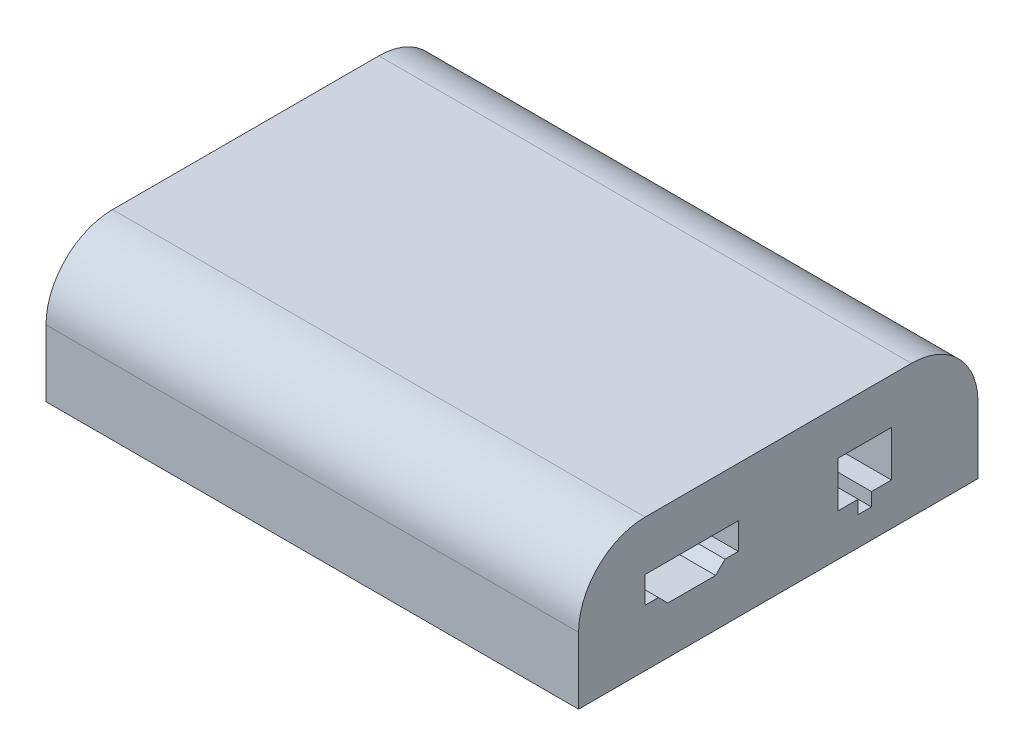
ISO-10303-21;
HEADER;
FILE_DESCRIPTION(('STEP AP214'),'2;1');
FILE_NAME('part.step','',(''),(''),'','','');
FILE_SCHEMA(('AUTOMOTIVE_DESIGN { 1 0 10303 214 1 1 1 1 }'));
ENDSEC;
DATA;
#1=APPLICATION_CONTEXT('core data for automotive mechanical design processes');
#2=APPLICATION_PROTOCOL_DEFINITION('international standard','automotive_design',2000,#1);
#3=PRODUCT_CONTEXT('',#1,'mechanical');
#4=PRODUCT('Part','Part','',(#3));
#5=PRODUCT_RELATED_PRODUCT_CATEGORY('part','',(#4));
#6=PRODUCT_DEFINITION_FORMATION('','',#4);
#7=PRODUCT_DEFINITION_CONTEXT('part definition',#1,'design');
#8=PRODUCT_DEFINITION('design','',#6,#7);
#9=PRODUCT_DEFINITION_SHAPE('','',#8);
#10=(LENGTH_UNIT() NAMED_UNIT(*) SI_UNIT(.MILLI.,.METRE.));
#11=(NAMED_UNIT(*) PLANE_ANGLE_UNIT() SI_UNIT($,.RADIAN.));
#12=(NAMED_UNIT(*) SI_UNIT($,.STERADIAN.) SOLID_ANGLE_UNIT());
#13=UNCERTAINTY_MEASURE_WITH_UNIT(LENGTH_MEASURE(1.E-05),#10,'distance_accuracy_value','');
#14=(GEOMETRIC_REPRESENTATION_CONTEXT(3) GLOBAL_UNCERTAINTY_ASSIGNED_CONTEXT((#13)) GLOBAL_UNIT_ASSIGNED_CONTEXT((#10,
#11,#12)) REPRESENTATION_CONTEXT('',''));
#15=CARTESIAN_POINT('',(0.,0.,0.));
#16=DIRECTION('',(0.,0.,1.));
#17=DIRECTION('',(1.,0.,0.));
#18=AXIS2_PLACEMENT_3D('',#15,#16,#17);
#19=CARTESIAN_POINT('',(0.,20.,0.));
#20=DIRECTION('',(1.,0.,0.));
#21=DIRECTION('',(0.,0.,-1.));
#22=AXIS2_PLACEMENT_3D('',#19,#20,#21);
#23=PLANE('',#22);
#24=DIRECTION('',(0.,0.,-1.));
#25=VECTOR('',#24,1.);
#26=CARTESIAN_POINT('',(0.,12.5290988396238,-10.));
#27=LINE('',#26,#25);
#28=CARTESIAN_POINT('',(0.,12.5290988396238,-10.));
#29=VERTEX_POINT('',#28);
#30=CARTESIAN_POINT('',(0.,12.5290988396238,-24.));
#31=VERTEX_POINT('',#30);
#32=EDGE_CURVE('E290',#29,#31,#27,.T.);
#33=ORIENTED_EDGE('',*,*,#32,.F.);
#34=DIRECTION('',(0.,1.,0.));
#35=VECTOR('',#34,1.);
#36=CARTESIAN_POINT('',(0.,8.52909883962411,-10.0000000000003));
#37=LINE('',#36,#35);
#38=CARTESIAN_POINT('',(0.,8.52909883962411,-10.0000000000003));
#39=VERTEX_POINT('',#38);
#40=EDGE_CURVE('E57',#39,#29,#37,.T.);
#41=ORIENTED_EDGE('',*,*,#40,.F.);
#42=DIRECTION('',(0.,0.,1.));
#43=VECTOR('',#42,1.);
#44=CARTESIAN_POINT('',(0.,8.52909883962411,-12.0000000000003));
#45=LINE('',#44,#43);
#46=CARTESIAN_POINT('',(0.,8.52909883962411,-12.0000000000003));
#47=VERTEX_POINT('',#46);
#48=EDGE_CURVE('E262',#47,#39,#45,.T.);
#49=ORIENTED_EDGE('',*,*,#48,.F.);
#50=DIRECTION('',(0.,0.7071067811867,0.707106781186395));
#51=VECTOR('',#50,1.);
#52=CARTESIAN_POINT('',(0.,7.11488527725071,-13.4142135623731));
#53=LINE('',#52,#51);
#54=CARTESIAN_POINT('',(0.,7.11488527725071,-13.4142135623731));
#55=VERTEX_POINT('',#54);
#56=EDGE_CURVE('E266',#55,#47,#53,.T.);
#57=ORIENTED_EDGE('',*,*,#56,.F.);
#58=DIRECTION('',(0.,0.,1.));
#59=VECTOR('',#58,1.);
#60=CARTESIAN_POINT('',(0.,7.11488527725071,-20.5857864376269));
#61=LINE('',#60,#59);
#62=CARTESIAN_POINT('',(0.,7.11488527725071,-20.5857864376269));
#63=VERTEX_POINT('',#62);
#64=EDGE_CURVE('E305',#63,#55,#61,.T.);
#65=ORIENTED_EDGE('',*,*,#64,.F.);
#66=DIRECTION('',(0.,-0.707106781186553,0.707106781186542));
#67=VECTOR('',#66,1.);
#68=CARTESIAN_POINT('',(0.,8.52909883962382,-22.));
#69=LINE('',#68,#67);
#70=CARTESIAN_POINT('',(0.,8.52909883962382,-22.));
#71=VERTEX_POINT('',#70);
#72=EDGE_CURVE('E301',#71,#63,#69,.T.);
#73=ORIENTED_EDGE('',*,*,#72,.F.);
#74=DIRECTION('',(0.,0.,1.));
#75=VECTOR('',#74,1.);
#76=CARTESIAN_POINT('',(0.,8.52909883962381,-24.));
#77=LINE('',#76,#75);
#78=CARTESIAN_POINT('',(0.,8.52909883962381,-24.));
#79=VERTEX_POINT('',#78);
#80=EDGE_CURVE('E297',#79,#71,#77,.T.);
#81=ORIENTED_EDGE('',*,*,#80,.F.);
#82=DIRECTION('',(0.,-1.,0.));
#83=VECTOR('',#82,1.);
#84=CARTESIAN_POINT('',(0.,12.5290988396238,-24.));
#85=LINE('',#84,#83);
#86=EDGE_CURVE('E293',#31,#79,#85,.T.);
#87=ORIENTED_EDGE('',*,*,#86,.F.);
#88=EDGE_LOOP('',(#33,#41,#49,#57,#65,#73,#81,#87));
#89=FACE_BOUND('',#88,.T.);
#90=DIRECTION('',(0.,-1.,0.));
#91=VECTOR('',#90,1.);
#92=CARTESIAN_POINT('',(0.,20.,0.));
#93=LINE('',#92,#91);
#94=CARTESIAN_POINT('',(0.,10.,0.));
#95=VERTEX_POINT('',#94);
#96=CARTESIAN_POINT('',(0.,0.,0.));
#97=VERTEX_POINT('',#96);
#98=EDGE_CURVE('E541',#95,#97,#93,.T.);
#99=ORIENTED_EDGE('',*,*,#98,.F.);
#100=CARTESIAN_POINT('',(0.,10.,-10.));
#101=DIRECTION('',(1.,0.,0.));
#102=DIRECTION('',(0.,0.,-1.));
#103=AXIS2_PLACEMENT_3D('',#100,#101,#102);
#104=CIRCLE('',#103,10.);
#105=CARTESIAN_POINT('',(0.,20.,-10.));
#106=VERTEX_POINT('',#105);
#107=EDGE_CURVE('E50',#95,#106,#104,.F.);
#108=ORIENTED_EDGE('',*,*,#107,.T.);
#109=DIRECTION('',(0.,0.,1.));
#110=VECTOR('',#109,1.);
#111=CARTESIAN_POINT('',(0.,20.,0.));
#112=LINE('',#111,#110);
#113=CARTESIAN_POINT('',(0.,20.,-50.));
#114=VERTEX_POINT('',#113);
#115=EDGE_CURVE('E509',#114,#106,#112,.T.);
#116=ORIENTED_EDGE('',*,*,#115,.F.);
#117=CARTESIAN_POINT('',(0.,10.,-50.));
#118=DIRECTION('',(1.,0.,0.));
#119=DIRECTION('',(0.,0.,-1.));
#120=AXIS2_PLACEMENT_3D('',#117,#118,#119);
#121=CIRCLE('',#120,10.);
#122=CARTESIAN_POINT('',(0.,10.,-60.));
#123=VERTEX_POINT('',#122);
#124=EDGE_CURVE('E65',#114,#123,#121,.F.);
#125=ORIENTED_EDGE('',*,*,#124,.T.);
#126=DIRECTION('',(0.,-1.,0.));
#127=VECTOR('',#126,1.);
#128=CARTESIAN_POINT('',(0.,20.,-60.));
#129=LINE('',#128,#127);
#130=CARTESIAN_POINT('',(0.,0.,-60.));
#131=VERTEX_POINT('',#130);
#132=EDGE_CURVE('E518',#123,#131,#129,.T.);
#133=ORIENTED_EDGE('',*,*,#132,.T.);
#134=DIRECTION('',(0.,0.,1.));
#135=VECTOR('',#134,1.);
#136=CARTESIAN_POINT('',(0.,0.,0.));
#137=LINE('',#136,#135);
#138=EDGE_CURVE('E401',#131,#97,#137,.T.);
#139=ORIENTED_EDGE('',*,*,#138,.T.);
#140=EDGE_LOOP('',(#99,#108,#116,#125,#133,#139));
#141=FACE_BOUND('',#140,.T.);
#142=ADVANCED_FACE('F41',(#89,#141),#23,.F.);
#143=CARTESIAN_POINT('',(0.,20.,0.));
#144=DIRECTION('',(0.,0.,-1.));
#145=DIRECTION('',(-1.,0.,0.));
#146=AXIS2_PLACEMENT_3D('',#143,#144,#145);
#147=PLANE('',#146);
#148=DIRECTION('',(0.,-1.,0.));
#149=VECTOR('',#148,1.);
#150=CARTESIAN_POINT('',(80.,20.,0.));
#151=LINE('',#150,#149);
#152=CARTESIAN_POINT('',(80.,10.,0.));
#153=VERTEX_POINT('',#152);
#154=CARTESIAN_POINT('',(80.,0.,0.));
#155=VERTEX_POINT('',#154);
#156=EDGE_CURVE('E538',#153,#155,#151,.T.);
#157=ORIENTED_EDGE('',*,*,#156,.F.);
#158=DIRECTION('',(1.,0.,0.));
#159=VECTOR('',#158,1.);
#160=CARTESIAN_POINT('',(0.,10.,0.));
#161=LINE('',#160,#159);
#162=EDGE_CURVE('E558',#153,#95,#161,.F.);
#163=ORIENTED_EDGE('',*,*,#162,.T.);
#164=ORIENTED_EDGE('',*,*,#98,.T.);
#165=DIRECTION('',(1.,0.,0.));
#166=VECTOR('',#165,1.);
#167=CARTESIAN_POINT('',(0.,0.,0.));
#168=LINE('',#167,#166);
#169=EDGE_CURVE('E522',#97,#155,#168,.T.);
#170=ORIENTED_EDGE('',*,*,#169,.T.);
#171=EDGE_LOOP('',(#157,#163,#164,#170));
#172=FACE_BOUND('',#171,.T.);
#173=ADVANCED_FACE('F577',(#172),#147,.F.);
#174=CARTESIAN_POINT('',(80.,20.,0.));
#175=DIRECTION('',(-1.,0.,0.));
#176=DIRECTION('',(0.,0.,1.));
#177=AXIS2_PLACEMENT_3D('',#174,#175,#176);
#178=PLANE('',#177);
#179=DIRECTION('',(0.,-1.,0.));
#180=VECTOR('',#179,1.);
#181=CARTESIAN_POINT('',(80.,12.5290988396238,-10.));
#182=LINE('',#181,#180);
#183=CARTESIAN_POINT('',(80.,12.5290988396238,-10.));
#184=VERTEX_POINT('',#183);
#185=CARTESIAN_POINT('',(80.,8.52909883962411,-10.0000000000003));
#186=VERTEX_POINT('',#185);
#187=EDGE_CURVE('E370',#184,#186,#182,.T.);
#188=ORIENTED_EDGE('',*,*,#187,.F.);
#189=DIRECTION('',(0.,0.,1.));
#190=VECTOR('',#189,1.);
#191=CARTESIAN_POINT('',(80.,12.5290988396238,-24.));
#192=LINE('',#191,#190);
#193=CARTESIAN_POINT('',(80.,12.5290988396238,-24.));
#194=VERTEX_POINT('',#193);
#195=EDGE_CURVE('E367',#194,#184,#192,.T.);
#196=ORIENTED_EDGE('',*,*,#195,.F.);
#197=DIRECTION('',(0.,1.,0.));
#198=VECTOR('',#197,1.);
#199=CARTESIAN_POINT('',(80.,8.52909883962381,-24.));
#200=LINE('',#199,#198);
#201=CARTESIAN_POINT('',(80.,8.52909883962381,-24.));
#202=VERTEX_POINT('',#201);
#203=EDGE_CURVE('E338',#202,#194,#200,.T.);
#204=ORIENTED_EDGE('',*,*,#203,.F.);
#205=DIRECTION('',(0.,0.,-1.));
#206=VECTOR('',#205,1.);
#207=CARTESIAN_POINT('',(80.,8.52909883962382,-22.));
#208=LINE('',#207,#206);
#209=CARTESIAN_POINT('',(80.,8.52909883962382,-22.));
#210=VERTEX_POINT('',#209);
#211=EDGE_CURVE('E391',#210,#202,#208,.T.);
#212=ORIENTED_EDGE('',*,*,#211,.F.);
#213=DIRECTION('',(0.,0.707106781186553,-0.707106781186542));
#214=VECTOR('',#213,1.);
#215=CARTESIAN_POINT('',(80.,7.11488527725071,-20.5857864376269));
#216=LINE('',#215,#214);
#217=CARTESIAN_POINT('',(80.,7.11488527725071,-20.5857864376269));
#218=VERTEX_POINT('',#217);
#219=EDGE_CURVE('E387',#218,#210,#216,.T.);
#220=ORIENTED_EDGE('',*,*,#219,.F.);
#221=DIRECTION('',(0.,0.,-1.));
#222=VECTOR('',#221,1.);
#223=CARTESIAN_POINT('',(80.,7.11488527725071,-13.4142135623731));
#224=LINE('',#223,#222);
#225=CARTESIAN_POINT('',(80.,7.11488527725071,-13.4142135623731));
#226=VERTEX_POINT('',#225);
#227=EDGE_CURVE('E383',#226,#218,#224,.T.);
#228=ORIENTED_EDGE('',*,*,#227,.F.);
#229=DIRECTION('',(0.,-0.7071067811867,-0.707106781186395));
#230=VECTOR('',#229,1.);
#231=CARTESIAN_POINT('',(80.,8.52909883962411,-12.0000000000003));
#232=LINE('',#231,#230);
#233=CARTESIAN_POINT('',(80.,8.52909883962411,-12.0000000000003));
#234=VERTEX_POINT('',#233);
#235=EDGE_CURVE('E379',#234,#226,#232,.T.);
#236=ORIENTED_EDGE('',*,*,#235,.F.);
#237=DIRECTION('',(0.,0.,-1.));
#238=VECTOR('',#237,1.);
#239=CARTESIAN_POINT('',(80.,8.52909883962411,-10.0000000000003));
#240=LINE('',#239,#238);
#241=EDGE_CURVE('E375',#186,#234,#240,.T.);
#242=ORIENTED_EDGE('',*,*,#241,.F.);
#243=EDGE_LOOP('',(#188,#196,#204,#212,#220,#228,#236,#242));
#244=FACE_BOUND('',#243,.T.);
#245=DIRECTION('',(0.,0.,-1.));
#246=VECTOR('',#245,1.);
#247=CARTESIAN_POINT('',(80.,6.31883722672472,-39.));
#248=LINE('',#247,#246);
#249=CARTESIAN_POINT('',(80.,6.31883722672472,-39.));
#250=VERTEX_POINT('',#249);
#251=CARTESIAN_POINT('',(80.,6.31883722672472,-42.001862325954));
#252=VERTEX_POINT('',#251);
#253=EDGE_CURVE('E459',#250,#252,#248,.T.);
#254=ORIENTED_EDGE('',*,*,#253,.F.);
#255=DIRECTION('',(0.,-1.,0.));
#256=VECTOR('',#255,1.);
#257=CARTESIAN_POINT('',(80.,13.1655281489185,-39.));
#258=LINE('',#257,#256);
#259=CARTESIAN_POINT('',(80.,13.1655281489185,-39.));
#260=VERTEX_POINT('',#259);
#261=EDGE_CURVE('E315',#260,#250,#258,.T.);
#262=ORIENTED_EDGE('',*,*,#261,.F.);
#263=DIRECTION('',(0.,0.,1.));
#264=VECTOR('',#263,1.);
#265=CARTESIAN_POINT('',(80.,13.1655281489185,-39.));
#266=LINE('',#265,#264);
#267=CARTESIAN_POINT('',(80.,13.1655281489185,-47.));
#268=VERTEX_POINT('',#267);
#269=EDGE_CURVE('E428',#268,#260,#266,.T.);
#270=ORIENTED_EDGE('',*,*,#269,.F.);
#271=DIRECTION('',(0.,1.,0.));
#272=VECTOR('',#271,1.);
#273=CARTESIAN_POINT('',(80.,13.1655281489185,-47.));
#274=LINE('',#273,#272);
#275=CARTESIAN_POINT('',(80.,6.31883722672472,-47.));
#276=VERTEX_POINT('',#275);
#277=EDGE_CURVE('E479',#276,#268,#274,.T.);
#278=ORIENTED_EDGE('',*,*,#277,.F.);
#279=DIRECTION('',(0.,0.,-1.));
#280=VECTOR('',#279,1.);
#281=CARTESIAN_POINT('',(80.,6.31883722672472,-43.998137674046));
#282=LINE('',#281,#280);
#283=CARTESIAN_POINT('',(80.,6.31883722672472,-43.998137674046));
#284=VERTEX_POINT('',#283);
#285=EDGE_CURVE('E475',#284,#276,#282,.T.);
#286=ORIENTED_EDGE('',*,*,#285,.F.);
#287=DIRECTION('',(0.,1.,0.));
#288=VECTOR('',#287,1.);
#289=CARTESIAN_POINT('',(80.,6.31883722672472,-43.998137674046));
#290=LINE('',#289,#288);
#291=CARTESIAN_POINT('',(80.,4.31883722672472,-43.998137674046));
#292=VERTEX_POINT('',#291);
#293=EDGE_CURVE('E471',#292,#284,#290,.T.);
#294=ORIENTED_EDGE('',*,*,#293,.F.);
#295=DIRECTION('',(0.,0.,-1.));
#296=VECTOR('',#295,1.);
#297=CARTESIAN_POINT('',(80.,4.31883722672472,-43.998137674046));
#298=LINE('',#297,#296);
#299=CARTESIAN_POINT('',(80.,4.31883722672472,-42.001862325954));
#300=VERTEX_POINT('',#299);
#301=EDGE_CURVE('E467',#300,#292,#298,.T.);
#302=ORIENTED_EDGE('',*,*,#301,.F.);
#303=DIRECTION('',(0.,-1.,0.));
#304=VECTOR('',#303,1.);
#305=CARTESIAN_POINT('',(80.,6.31883722672472,-42.001862325954));
#306=LINE('',#305,#304);
#307=EDGE_CURVE('E463',#252,#300,#306,.T.);
#308=ORIENTED_EDGE('',*,*,#307,.F.);
#309=EDGE_LOOP('',(#254,#262,#270,#278,#286,#294,#302,#308));
#310=FACE_BOUND('',#309,.T.);
#311=DIRECTION('',(0.,0.,-1.));
#312=VECTOR('',#311,1.);
#313=CARTESIAN_POINT('',(80.,20.,0.));
#314=LINE('',#313,#312);
#315=CARTESIAN_POINT('',(80.,20.,-10.));
#316=VERTEX_POINT('',#315);
#317=CARTESIAN_POINT('',(80.,20.,-50.));
#318=VERTEX_POINT('',#317);
#319=EDGE_CURVE('E513',#316,#318,#314,.T.);
#320=ORIENTED_EDGE('',*,*,#319,.F.);
#321=CARTESIAN_POINT('',(80.,10.,-10.));
#322=DIRECTION('',(-1.,0.,0.));
#323=DIRECTION('',(0.,0.,1.));
#324=AXIS2_PLACEMENT_3D('',#321,#322,#323);
#325=CIRCLE('',#324,10.);
#326=EDGE_CURVE('E555',#316,#153,#325,.F.);
#327=ORIENTED_EDGE('',*,*,#326,.T.);
#328=ORIENTED_EDGE('',*,*,#156,.T.);
#329=DIRECTION('',(0.,0.,-1.));
#330=VECTOR('',#329,1.);
#331=CARTESIAN_POINT('',(80.,0.,0.));
#332=LINE('',#331,#330);
#333=CARTESIAN_POINT('',(80.,0.,-60.));
#334=VERTEX_POINT('',#333);
#335=EDGE_CURVE('E526',#155,#334,#332,.T.);
#336=ORIENTED_EDGE('',*,*,#335,.T.);
#337=DIRECTION('',(0.,-1.,0.));
#338=VECTOR('',#337,1.);
#339=CARTESIAN_POINT('',(80.,20.,-60.));
#340=LINE('',#339,#338);
#341=CARTESIAN_POINT('',(80.,10.,-60.));
#342=VERTEX_POINT('',#341);
#343=EDGE_CURVE('E535',#342,#334,#340,.T.);
#344=ORIENTED_EDGE('',*,*,#343,.F.);
#345=CARTESIAN_POINT('',(80.,10.,-50.));
#346=DIRECTION('',(-1.,0.,0.));
#347=DIRECTION('',(0.,0.,1.));
#348=AXIS2_PLACEMENT_3D('',#345,#346,#347);
#349=CIRCLE('',#348,10.);
#350=EDGE_CURVE('E552',#342,#318,#349,.F.);
#351=ORIENTED_EDGE('',*,*,#350,.T.);
#352=EDGE_LOOP('',(#320,#327,#328,#336,#344,#351));
#353=FACE_BOUND('',#352,.T.);
#354=ADVANCED_FACE('F575',(#244,#310,#353),#178,.F.);
#355=CARTESIAN_POINT('',(0.,20.,-60.));
#356=DIRECTION('',(0.,0.,1.));
#357=DIRECTION('',(1.,0.,0.));
#358=AXIS2_PLACEMENT_3D('',#355,#356,#357);
#359=PLANE('',#358);
#360=ORIENTED_EDGE('',*,*,#132,.F.);
#361=DIRECTION('',(-1.,0.,0.));
#362=VECTOR('',#361,1.);
#363=CARTESIAN_POINT('',(0.,10.,-60.));
#364=LINE('',#363,#362);
#365=EDGE_CURVE('E11',#123,#342,#364,.F.);
#366=ORIENTED_EDGE('',*,*,#365,.T.);
#367=ORIENTED_EDGE('',*,*,#343,.T.);
#368=DIRECTION('',(-1.,0.,0.));
#369=VECTOR('',#368,1.);
#370=CARTESIAN_POINT('',(0.,0.,-60.));
#371=LINE('',#370,#369);
#372=EDGE_CURVE('E514',#334,#131,#371,.T.);
#373=ORIENTED_EDGE('',*,*,#372,.T.);
#374=EDGE_LOOP('',(#360,#366,#367,#373));
#375=FACE_BOUND('',#374,.T.);
#376=ADVANCED_FACE('F589',(#375),#359,.F.);
#377=CARTESIAN_POINT('',(0.,20.,0.));
#378=DIRECTION('',(0.,-1.,0.));
#379=DIRECTION('',(0.,0.,-1.));
#380=AXIS2_PLACEMENT_3D('',#377,#378,#379);
#381=PLANE('',#380);
#382=ORIENTED_EDGE('',*,*,#115,.T.);
#383=DIRECTION('',(1.,0.,0.));
#384=VECTOR('',#383,1.);
#385=CARTESIAN_POINT('',(0.,20.,-10.));
#386=LINE('',#385,#384);
#387=EDGE_CURVE('E548',#106,#316,#386,.T.);
#388=ORIENTED_EDGE('',*,*,#387,.T.);
#389=ORIENTED_EDGE('',*,*,#319,.T.);
#390=DIRECTION('',(-1.,0.,0.));
#391=VECTOR('',#390,1.);
#392=CARTESIAN_POINT('',(0.,20.,-50.));
#393=LINE('',#392,#391);
#394=EDGE_CURVE('E544',#318,#114,#393,.T.);
#395=ORIENTED_EDGE('',*,*,#394,.T.);
#396=EDGE_LOOP('',(#382,#388,#389,#395));
#397=FACE_BOUND('',#396,.T.);
#398=ADVANCED_FACE('F569',(#397),#381,.F.);
#399=CARTESIAN_POINT('',(0.,0.,0.));
#400=DIRECTION('',(0.,-1.,0.));
#401=DIRECTION('',(0.,0.,-1.));
#402=AXIS2_PLACEMENT_3D('',#399,#400,#401);
#403=PLANE('',#402);
#404=ORIENTED_EDGE('',*,*,#138,.F.);
#405=ORIENTED_EDGE('',*,*,#372,.F.);
#406=ORIENTED_EDGE('',*,*,#335,.F.);
#407=ORIENTED_EDGE('',*,*,#169,.F.);
#408=EDGE_LOOP('',(#404,#405,#406,#407));
#409=FACE_BOUND('',#408,.T.);
#410=ADVANCED_FACE('F583',(#409),#403,.T.);
#411=CARTESIAN_POINT('',(60.,13.1655281489185,-39.));
#412=DIRECTION('',(0.,0.,1.));
#413=DIRECTION('',(1.,0.,0.));
#414=AXIS2_PLACEMENT_3D('',#411,#412,#413);
#415=PLANE('',#414);
#416=ORIENTED_EDGE('',*,*,#261,.T.);
#417=DIRECTION('',(1.,0.,0.));
#418=VECTOR('',#417,1.);
#419=CARTESIAN_POINT('',(60.,6.31883722672472,-39.));
#420=LINE('',#419,#418);
#421=CARTESIAN_POINT('',(60.,6.31883722672472,-39.));
#422=VERTEX_POINT('',#421);
#423=EDGE_CURVE('E456',#422,#250,#420,.T.);
#424=ORIENTED_EDGE('',*,*,#423,.F.);
#425=DIRECTION('',(0.,-1.,0.));
#426=VECTOR('',#425,1.);
#427=CARTESIAN_POINT('',(60.,13.1655281489185,-39.));
#428=LINE('',#427,#426);
#429=CARTESIAN_POINT('',(60.,13.1655281489185,-39.));
#430=VERTEX_POINT('',#429);
#431=EDGE_CURVE('E423',#430,#422,#428,.T.);
#432=ORIENTED_EDGE('',*,*,#431,.F.);
#433=DIRECTION('',(1.,0.,0.));
#434=VECTOR('',#433,1.);
#435=CARTESIAN_POINT('',(60.,13.1655281489185,-39.));
#436=LINE('',#435,#434);
#437=EDGE_CURVE('E371',#430,#260,#436,.T.);
#438=ORIENTED_EDGE('',*,*,#437,.T.);
#439=EDGE_LOOP('',(#416,#424,#432,#438));
#440=FACE_BOUND('',#439,.T.);
#441=ADVANCED_FACE('F661',(#440),#415,.F.);
#442=CARTESIAN_POINT('',(60.,13.1655281489185,-39.));
#443=DIRECTION('',(0.,1.,0.));
#444=DIRECTION('',(0.,0.,1.));
#445=AXIS2_PLACEMENT_3D('',#442,#443,#444);
#446=PLANE('',#445);
#447=ORIENTED_EDGE('',*,*,#269,.T.);
#448=ORIENTED_EDGE('',*,*,#437,.F.);
#449=DIRECTION('',(0.,0.,1.));
#450=VECTOR('',#449,1.);
#451=CARTESIAN_POINT('',(60.,13.1655281489185,-39.));
#452=LINE('',#451,#450);
#453=CARTESIAN_POINT('',(60.,13.1655281489185,-47.));
#454=VERTEX_POINT('',#453);
#455=EDGE_CURVE('E452',#454,#430,#452,.T.);
#456=ORIENTED_EDGE('',*,*,#455,.F.);
#457=DIRECTION('',(1.,0.,0.));
#458=VECTOR('',#457,1.);
#459=CARTESIAN_POINT('',(60.,13.1655281489185,-47.));
#460=LINE('',#459,#458);
#461=EDGE_CURVE('E488',#454,#268,#460,.T.);
#462=ORIENTED_EDGE('',*,*,#461,.T.);
#463=EDGE_LOOP('',(#447,#448,#456,#462));
#464=FACE_BOUND('',#463,.T.);
#465=ADVANCED_FACE('F657',(#464),#446,.F.);
#466=CARTESIAN_POINT('',(60.,13.1655281489185,-47.));
#467=DIRECTION('',(0.,0.,-1.));
#468=DIRECTION('',(0.,1.,0.));
#469=AXIS2_PLACEMENT_3D('',#466,#467,#468);
#470=PLANE('',#469);
#471=ORIENTED_EDGE('',*,*,#277,.T.);
#472=ORIENTED_EDGE('',*,*,#461,.F.);
#473=DIRECTION('',(0.,1.,0.));
#474=VECTOR('',#473,1.);
#475=CARTESIAN_POINT('',(60.,13.1655281489185,-47.));
#476=LINE('',#475,#474);
#477=CARTESIAN_POINT('',(60.,6.31883722672472,-47.));
#478=VERTEX_POINT('',#477);
#479=EDGE_CURVE('E448',#478,#454,#476,.T.);
#480=ORIENTED_EDGE('',*,*,#479,.F.);
#481=DIRECTION('',(1.,0.,0.));
#482=VECTOR('',#481,1.);
#483=CARTESIAN_POINT('',(60.,6.31883722672472,-47.));
#484=LINE('',#483,#482);
#485=EDGE_CURVE('E491',#478,#276,#484,.T.);
#486=ORIENTED_EDGE('',*,*,#485,.T.);
#487=EDGE_LOOP('',(#471,#472,#480,#486));
#488=FACE_BOUND('',#487,.T.);
#489=ADVANCED_FACE('F660',(#488),#470,.F.);
#490=CARTESIAN_POINT('',(60.,6.31883722672472,-43.998137674046));
#491=DIRECTION('',(0.,-1.,0.));
#492=DIRECTION('',(0.,0.,-1.));
#493=AXIS2_PLACEMENT_3D('',#490,#491,#492);
#494=PLANE('',#493);
#495=ORIENTED_EDGE('',*,*,#285,.T.);
#496=ORIENTED_EDGE('',*,*,#485,.F.);
#497=DIRECTION('',(0.,0.,-1.));
#498=VECTOR('',#497,1.);
#499=CARTESIAN_POINT('',(60.,6.31883722672472,-43.998137674046));
#500=LINE('',#499,#498);
#501=CARTESIAN_POINT('',(60.,6.31883722672472,-43.998137674046));
#502=VERTEX_POINT('',#501);
#503=EDGE_CURVE('E444',#502,#478,#500,.T.);
#504=ORIENTED_EDGE('',*,*,#503,.F.);
#505=DIRECTION('',(1.,0.,0.));
#506=VECTOR('',#505,1.);
#507=CARTESIAN_POINT('',(60.,6.31883722672472,-43.998137674046));
#508=LINE('',#507,#506);
#509=EDGE_CURVE('E494',#502,#284,#508,.T.);
#510=ORIENTED_EDGE('',*,*,#509,.T.);
#511=EDGE_LOOP('',(#495,#496,#504,#510));
#512=FACE_BOUND('',#511,.T.);
#513=ADVANCED_FACE('F665',(#512),#494,.F.);
#514=CARTESIAN_POINT('',(60.,6.31883722672472,-43.998137674046));
#515=DIRECTION('',(0.,0.,-1.));
#516=DIRECTION('',(-1.,0.,0.));
#517=AXIS2_PLACEMENT_3D('',#514,#515,#516);
#518=PLANE('',#517);
#519=ORIENTED_EDGE('',*,*,#293,.T.);
#520=ORIENTED_EDGE('',*,*,#509,.F.);
#521=DIRECTION('',(0.,1.,0.));
#522=VECTOR('',#521,1.);
#523=CARTESIAN_POINT('',(60.,6.31883722672472,-43.998137674046));
#524=LINE('',#523,#522);
#525=CARTESIAN_POINT('',(60.,4.31883722672472,-43.998137674046));
#526=VERTEX_POINT('',#525);
#527=EDGE_CURVE('E440',#526,#502,#524,.T.);
#528=ORIENTED_EDGE('',*,*,#527,.F.);
#529=DIRECTION('',(1.,0.,0.));
#530=VECTOR('',#529,1.);
#531=CARTESIAN_POINT('',(60.,4.31883722672472,-43.998137674046));
#532=LINE('',#531,#530);
#533=EDGE_CURVE('E497',#526,#292,#532,.T.);
#534=ORIENTED_EDGE('',*,*,#533,.T.);
#535=EDGE_LOOP('',(#519,#520,#528,#534));
#536=FACE_BOUND('',#535,.T.);
#537=ADVANCED_FACE('F669',(#536),#518,.F.);
#538=CARTESIAN_POINT('',(60.,4.31883722672472,-43.998137674046));
#539=DIRECTION('',(0.,-1.,0.));
#540=DIRECTION('',(0.,0.,-1.));
#541=AXIS2_PLACEMENT_3D('',#538,#539,#540);
#542=PLANE('',#541);
#543=ORIENTED_EDGE('',*,*,#301,.T.);
#544=ORIENTED_EDGE('',*,*,#533,.F.);
#545=DIRECTION('',(0.,0.,-1.));
#546=VECTOR('',#545,1.);
#547=CARTESIAN_POINT('',(60.,4.31883722672472,-43.998137674046));
#548=LINE('',#547,#546);
#549=CARTESIAN_POINT('',(60.,4.31883722672472,-42.001862325954));
#550=VERTEX_POINT('',#549);
#551=EDGE_CURVE('E436',#550,#526,#548,.T.);
#552=ORIENTED_EDGE('',*,*,#551,.F.);
#553=DIRECTION('',(1.,0.,0.));
#554=VECTOR('',#553,1.);
#555=CARTESIAN_POINT('',(60.,4.31883722672472,-42.001862325954));
#556=LINE('',#555,#554);
#557=EDGE_CURVE('E500',#550,#300,#556,.T.);
#558=ORIENTED_EDGE('',*,*,#557,.T.);
#559=EDGE_LOOP('',(#543,#544,#552,#558));
#560=FACE_BOUND('',#559,.T.);
#561=ADVANCED_FACE('F673',(#560),#542,.F.);
#562=CARTESIAN_POINT('',(60.,6.31883722672472,-42.001862325954));
#563=DIRECTION('',(0.,0.,1.));
#564=DIRECTION('',(1.,0.,0.));
#565=AXIS2_PLACEMENT_3D('',#562,#563,#564);
#566=PLANE('',#565);
#567=ORIENTED_EDGE('',*,*,#307,.T.);
#568=ORIENTED_EDGE('',*,*,#557,.F.);
#569=DIRECTION('',(0.,-1.,0.));
#570=VECTOR('',#569,1.);
#571=CARTESIAN_POINT('',(60.,6.31883722672472,-42.001862325954));
#572=LINE('',#571,#570);
#573=CARTESIAN_POINT('',(60.,6.31883722672472,-42.001862325954));
#574=VERTEX_POINT('',#573);
#575=EDGE_CURVE('E432',#574,#550,#572,.T.);
#576=ORIENTED_EDGE('',*,*,#575,.F.);
#577=DIRECTION('',(1.,0.,0.));
#578=VECTOR('',#577,1.);
#579=CARTESIAN_POINT('',(60.,6.31883722672472,-42.001862325954));
#580=LINE('',#579,#578);
#581=EDGE_CURVE('E503',#574,#252,#580,.T.);
#582=ORIENTED_EDGE('',*,*,#581,.T.);
#583=EDGE_LOOP('',(#567,#568,#576,#582));
#584=FACE_BOUND('',#583,.T.);
#585=ADVANCED_FACE('F677',(#584),#566,.F.);
#586=CARTESIAN_POINT('',(60.,6.31883722672472,-39.));
#587=DIRECTION('',(0.,-1.,0.));
#588=DIRECTION('',(0.,0.,-1.));
#589=AXIS2_PLACEMENT_3D('',#586,#587,#588);
#590=PLANE('',#589);
#591=ORIENTED_EDGE('',*,*,#253,.T.);
#592=ORIENTED_EDGE('',*,*,#581,.F.);
#593=DIRECTION('',(0.,0.,-1.));
#594=VECTOR('',#593,1.);
#595=CARTESIAN_POINT('',(60.,6.31883722672472,-39.));
#596=LINE('',#595,#594);
#597=EDGE_CURVE('E427',#422,#574,#596,.T.);
#598=ORIENTED_EDGE('',*,*,#597,.F.);
#599=ORIENTED_EDGE('',*,*,#423,.T.);
#600=EDGE_LOOP('',(#591,#592,#598,#599));
#601=FACE_BOUND('',#600,.T.);
#602=ADVANCED_FACE('F655',(#601),#590,.F.);
#603=CARTESIAN_POINT('',(60.,0.,0.));
#604=DIRECTION('',(1.,0.,0.));
#605=DIRECTION('',(0.,0.,-1.));
#606=AXIS2_PLACEMENT_3D('',#603,#604,#605);
#607=PLANE('',#606);
#608=ORIENTED_EDGE('',*,*,#431,.T.);
#609=ORIENTED_EDGE('',*,*,#597,.T.);
#610=ORIENTED_EDGE('',*,*,#575,.T.);
#611=ORIENTED_EDGE('',*,*,#551,.T.);
#612=ORIENTED_EDGE('',*,*,#527,.T.);
#613=ORIENTED_EDGE('',*,*,#503,.T.);
#614=ORIENTED_EDGE('',*,*,#479,.T.);
#615=ORIENTED_EDGE('',*,*,#455,.T.);
#616=EDGE_LOOP('',(#608,#609,#610,#611,#612,#613,#614,#615));
#617=FACE_BOUND('',#616,.T.);
#618=ADVANCED_FACE('F651',(#617),#607,.T.);
#619=CARTESIAN_POINT('',(60.,12.5290988396238,-24.));
#620=DIRECTION('',(0.,1.,0.));
#621=DIRECTION('',(0.,0.,1.));
#622=AXIS2_PLACEMENT_3D('',#619,#620,#621);
#623=PLANE('',#622);
#624=ORIENTED_EDGE('',*,*,#195,.T.);
#625=DIRECTION('',(1.,0.,0.));
#626=VECTOR('',#625,1.);
#627=CARTESIAN_POINT('',(60.,12.5290988396238,-10.));
#628=LINE('',#627,#626);
#629=CARTESIAN_POINT('',(60.,12.5290988396238,-10.));
#630=VERTEX_POINT('',#629);
#631=EDGE_CURVE('E366',#630,#184,#628,.T.);
#632=ORIENTED_EDGE('',*,*,#631,.F.);
#633=DIRECTION('',(0.,0.,1.));
#634=VECTOR('',#633,1.);
#635=CARTESIAN_POINT('',(60.,12.5290988396238,-24.));
#636=LINE('',#635,#634);
#637=CARTESIAN_POINT('',(60.,12.5290988396238,-24.));
#638=VERTEX_POINT('',#637);
#639=EDGE_CURVE('E333',#638,#630,#636,.T.);
#640=ORIENTED_EDGE('',*,*,#639,.F.);
#641=DIRECTION('',(1.,0.,0.));
#642=VECTOR('',#641,1.);
#643=CARTESIAN_POINT('',(60.,12.5290988396238,-24.));
#644=LINE('',#643,#642);
#645=EDGE_CURVE('E398',#638,#194,#644,.T.);
#646=ORIENTED_EDGE('',*,*,#645,.T.);
#647=EDGE_LOOP('',(#624,#632,#640,#646));
#648=FACE_BOUND('',#647,.T.);
#649=ADVANCED_FACE('F629',(#648),#623,.F.);
#650=CARTESIAN_POINT('',(60.,8.52909883962381,-24.));
#651=DIRECTION('',(0.,0.,-1.));
#652=DIRECTION('',(0.,1.,0.));
#653=AXIS2_PLACEMENT_3D('',#650,#651,#652);
#654=PLANE('',#653);
#655=ORIENTED_EDGE('',*,*,#203,.T.);
#656=ORIENTED_EDGE('',*,*,#645,.F.);
#657=DIRECTION('',(0.,1.,0.));
#658=VECTOR('',#657,1.);
#659=CARTESIAN_POINT('',(60.,8.52909883962381,-24.));
#660=LINE('',#659,#658);
#661=CARTESIAN_POINT('',(60.,8.52909883962381,-24.));
#662=VERTEX_POINT('',#661);
#663=EDGE_CURVE('E362',#662,#638,#660,.T.);
#664=ORIENTED_EDGE('',*,*,#663,.F.);
#665=DIRECTION('',(1.,0.,0.));
#666=VECTOR('',#665,1.);
#667=CARTESIAN_POINT('',(60.,8.52909883962381,-24.));
#668=LINE('',#667,#666);
#669=EDGE_CURVE('E402',#662,#202,#668,.T.);
#670=ORIENTED_EDGE('',*,*,#669,.T.);
#671=EDGE_LOOP('',(#655,#656,#664,#670));
#672=FACE_BOUND('',#671,.T.);
#673=ADVANCED_FACE('F625',(#672),#654,.F.);
#674=CARTESIAN_POINT('',(60.,8.52909883962382,-22.));
#675=DIRECTION('',(0.,-1.,0.));
#676=DIRECTION('',(0.,0.,-1.));
#677=AXIS2_PLACEMENT_3D('',#674,#675,#676);
#678=PLANE('',#677);
#679=ORIENTED_EDGE('',*,*,#211,.T.);
#680=ORIENTED_EDGE('',*,*,#669,.F.);
#681=DIRECTION('',(0.,0.,-1.));
#682=VECTOR('',#681,1.);
#683=CARTESIAN_POINT('',(60.,8.52909883962382,-22.));
#684=LINE('',#683,#682);
#685=CARTESIAN_POINT('',(60.,8.52909883962382,-22.));
#686=VERTEX_POINT('',#685);
#687=EDGE_CURVE('E358',#686,#662,#684,.T.);
#688=ORIENTED_EDGE('',*,*,#687,.F.);
#689=DIRECTION('',(1.,0.,0.));
#690=VECTOR('',#689,1.);
#691=CARTESIAN_POINT('',(60.,8.52909883962382,-22.));
#692=LINE('',#691,#690);
#693=EDGE_CURVE('E405',#686,#210,#692,.T.);
#694=ORIENTED_EDGE('',*,*,#693,.T.);
#695=EDGE_LOOP('',(#679,#680,#688,#694));
#696=FACE_BOUND('',#695,.T.);
#697=ADVANCED_FACE('F628',(#696),#678,.F.);
#698=CARTESIAN_POINT('',(60.,7.11488527725071,-20.5857864376269));
#699=DIRECTION('',(0.,-0.707106781186542,-0.707106781186553));
#700=DIRECTION('',(0.,0.707106781186553,-0.707106781186542));
#701=AXIS2_PLACEMENT_3D('',#698,#699,#700);
#702=PLANE('',#701);
#703=ORIENTED_EDGE('',*,*,#219,.T.);
#704=ORIENTED_EDGE('',*,*,#693,.F.);
#705=DIRECTION('',(0.,0.707106781186553,-0.707106781186542));
#706=VECTOR('',#705,1.);
#707=CARTESIAN_POINT('',(60.,7.11488527725071,-20.5857864376269));
#708=LINE('',#707,#706);
#709=CARTESIAN_POINT('',(60.,7.11488527725071,-20.5857864376269));
#710=VERTEX_POINT('',#709);
#711=EDGE_CURVE('E354',#710,#686,#708,.T.);
#712=ORIENTED_EDGE('',*,*,#711,.F.);
#713=DIRECTION('',(1.,0.,0.));
#714=VECTOR('',#713,1.);
#715=CARTESIAN_POINT('',(60.,7.11488527725071,-20.5857864376269));
#716=LINE('',#715,#714);
#717=EDGE_CURVE('E408',#710,#218,#716,.T.);
#718=ORIENTED_EDGE('',*,*,#717,.T.);
#719=EDGE_LOOP('',(#703,#704,#712,#718));
#720=FACE_BOUND('',#719,.T.);
#721=ADVANCED_FACE('F633',(#720),#702,.F.);
#722=CARTESIAN_POINT('',(60.,7.11488527725071,-13.4142135623731));
#723=DIRECTION('',(0.,-1.,0.));
#724=DIRECTION('',(0.,0.,-1.));
#725=AXIS2_PLACEMENT_3D('',#722,#723,#724);
#726=PLANE('',#725);
#727=ORIENTED_EDGE('',*,*,#227,.T.);
#728=ORIENTED_EDGE('',*,*,#717,.F.);
#729=DIRECTION('',(0.,0.,-1.));
#730=VECTOR('',#729,1.);
#731=CARTESIAN_POINT('',(60.,7.11488527725071,-13.4142135623731));
#732=LINE('',#731,#730);
#733=CARTESIAN_POINT('',(60.,7.11488527725071,-13.4142135623731));
#734=VERTEX_POINT('',#733);
#735=EDGE_CURVE('E350',#734,#710,#732,.T.);
#736=ORIENTED_EDGE('',*,*,#735,.F.);
#737=DIRECTION('',(1.,0.,0.));
#738=VECTOR('',#737,1.);
#739=CARTESIAN_POINT('',(60.,7.11488527725071,-13.4142135623731));
#740=LINE('',#739,#738);
#741=EDGE_CURVE('E411',#734,#226,#740,.T.);
#742=ORIENTED_EDGE('',*,*,#741,.T.);
#743=EDGE_LOOP('',(#727,#728,#736,#742));
#744=FACE_BOUND('',#743,.T.);
#745=ADVANCED_FACE('F637',(#744),#726,.F.);
#746=CARTESIAN_POINT('',(60.,8.52909883962411,-12.0000000000003));
#747=DIRECTION('',(0.,-0.707106781186395,0.7071067811867));
#748=DIRECTION('',(0.,-0.7071067811867,-0.707106781186395));
#749=AXIS2_PLACEMENT_3D('',#746,#747,#748);
#750=PLANE('',#749);
#751=ORIENTED_EDGE('',*,*,#235,.T.);
#752=ORIENTED_EDGE('',*,*,#741,.F.);
#753=DIRECTION('',(0.,-0.7071067811867,-0.707106781186395));
#754=VECTOR('',#753,1.);
#755=CARTESIAN_POINT('',(60.,8.52909883962411,-12.0000000000003));
#756=LINE('',#755,#754);
#757=CARTESIAN_POINT('',(60.,8.52909883962411,-12.0000000000003));
#758=VERTEX_POINT('',#757);
#759=EDGE_CURVE('E346',#758,#734,#756,.T.);
#760=ORIENTED_EDGE('',*,*,#759,.F.);
#761=DIRECTION('',(1.,0.,0.));
#762=VECTOR('',#761,1.);
#763=CARTESIAN_POINT('',(60.,8.52909883962411,-12.0000000000003));
#764=LINE('',#763,#762);
#765=EDGE_CURVE('E414',#758,#234,#764,.T.);
#766=ORIENTED_EDGE('',*,*,#765,.T.);
#767=EDGE_LOOP('',(#751,#752,#760,#766));
#768=FACE_BOUND('',#767,.T.);
#769=ADVANCED_FACE('F641',(#768),#750,.F.);
#770=CARTESIAN_POINT('',(60.,8.52909883962411,-10.0000000000003));
#771=DIRECTION('',(0.,-1.,0.));
#772=DIRECTION('',(0.,0.,-1.));
#773=AXIS2_PLACEMENT_3D('',#770,#771,#772);
#774=PLANE('',#773);
#775=ORIENTED_EDGE('',*,*,#241,.T.);
#776=ORIENTED_EDGE('',*,*,#765,.F.);
#777=DIRECTION('',(0.,0.,-1.));
#778=VECTOR('',#777,1.);
#779=CARTESIAN_POINT('',(60.,8.52909883962411,-10.0000000000003));
#780=LINE('',#779,#778);
#781=CARTESIAN_POINT('',(60.,8.52909883962411,-10.0000000000003));
#782=VERTEX_POINT('',#781);
#783=EDGE_CURVE('E342',#782,#758,#780,.T.);
#784=ORIENTED_EDGE('',*,*,#783,.F.);
#785=DIRECTION('',(1.,0.,0.));
#786=VECTOR('',#785,1.);
#787=CARTESIAN_POINT('',(60.,8.52909883962411,-10.0000000000003));
#788=LINE('',#787,#786);
#789=EDGE_CURVE('E417',#782,#186,#788,.T.);
#790=ORIENTED_EDGE('',*,*,#789,.T.);
#791=EDGE_LOOP('',(#775,#776,#784,#790));
#792=FACE_BOUND('',#791,.T.);
#793=ADVANCED_FACE('F619',(#792),#774,.F.);
#794=CARTESIAN_POINT('',(60.,12.5290988396238,-10.));
#795=DIRECTION('',(0.,0.,1.));
#796=DIRECTION('',(0.,-1.,0.));
#797=AXIS2_PLACEMENT_3D('',#794,#795,#796);
#798=PLANE('',#797);
#799=ORIENTED_EDGE('',*,*,#187,.T.);
#800=ORIENTED_EDGE('',*,*,#789,.F.);
#801=DIRECTION('',(0.,-1.,0.));
#802=VECTOR('',#801,1.);
#803=CARTESIAN_POINT('',(60.,12.5290988396238,-10.));
#804=LINE('',#803,#802);
#805=EDGE_CURVE('E337',#630,#782,#804,.T.);
#806=ORIENTED_EDGE('',*,*,#805,.F.);
#807=ORIENTED_EDGE('',*,*,#631,.T.);
#808=EDGE_LOOP('',(#799,#800,#806,#807));
#809=FACE_BOUND('',#808,.T.);
#810=ADVANCED_FACE('F613',(#809),#798,.F.);
#811=CARTESIAN_POINT('',(60.,0.,0.));
#812=DIRECTION('',(1.,0.,0.));
#813=DIRECTION('',(0.,0.,-1.));
#814=AXIS2_PLACEMENT_3D('',#811,#812,#813);
#815=PLANE('',#814);
#816=ORIENTED_EDGE('',*,*,#639,.T.);
#817=ORIENTED_EDGE('',*,*,#805,.T.);
#818=ORIENTED_EDGE('',*,*,#783,.T.);
#819=ORIENTED_EDGE('',*,*,#759,.T.);
#820=ORIENTED_EDGE('',*,*,#735,.T.);
#821=ORIENTED_EDGE('',*,*,#711,.T.);
#822=ORIENTED_EDGE('',*,*,#687,.T.);
#823=ORIENTED_EDGE('',*,*,#663,.T.);
#824=EDGE_LOOP('',(#816,#817,#818,#819,#820,#821,#822,#823));
#825=FACE_BOUND('',#824,.T.);
#826=ADVANCED_FACE('F608',(#825),#815,.T.);
#827=CARTESIAN_POINT('',(0.,10.,-10.));
#828=DIRECTION('',(1.,0.,0.));
#829=DIRECTION('',(0.,0.,-1.));
#830=AXIS2_PLACEMENT_3D('',#827,#828,#829);
#831=CYLINDRICAL_SURFACE('',#830,10.);
#832=ORIENTED_EDGE('',*,*,#107,.F.);
#833=ORIENTED_EDGE('',*,*,#162,.F.);
#834=ORIENTED_EDGE('',*,*,#326,.F.);
#835=ORIENTED_EDGE('',*,*,#387,.F.);
#836=EDGE_LOOP('',(#832,#833,#834,#835));
#837=FACE_BOUND('',#836,.T.);
#838=ADVANCED_FACE('F572',(#837),#831,.T.);
#839=CARTESIAN_POINT('',(0.,10.,-50.));
#840=DIRECTION('',(-1.,0.,0.));
#841=DIRECTION('',(0.,0.,1.));
#842=AXIS2_PLACEMENT_3D('',#839,#840,#841);
#843=CYLINDRICAL_SURFACE('',#842,10.);
#844=ORIENTED_EDGE('',*,*,#350,.F.);
#845=ORIENTED_EDGE('',*,*,#365,.F.);
#846=ORIENTED_EDGE('',*,*,#124,.F.);
#847=ORIENTED_EDGE('',*,*,#394,.F.);
#848=EDGE_LOOP('',(#844,#845,#846,#847));
#849=FACE_BOUND('',#848,.T.);
#850=ADVANCED_FACE('F43',(#849),#843,.T.);
#851=CARTESIAN_POINT('',(20.,8.52909883962411,-10.0000000000003));
#852=DIRECTION('',(0.,0.,1.));
#853=DIRECTION('',(0.,-1.,0.));
#854=AXIS2_PLACEMENT_3D('',#851,#852,#853);
#855=PLANE('',#854);
#856=ORIENTED_EDGE('',*,*,#40,.T.);
#857=DIRECTION('',(-1.,0.,0.));
#858=VECTOR('',#857,1.);
#859=CARTESIAN_POINT('',(20.,12.5290988396238,-10.));
#860=LINE('',#859,#858);
#861=CARTESIAN_POINT('',(20.,12.5290988396238,-10.));
#862=VERTEX_POINT('',#861);
#863=EDGE_CURVE('E236',#862,#29,#860,.T.);
#864=ORIENTED_EDGE('',*,*,#863,.F.);
#865=DIRECTION('',(0.,1.,0.));
#866=VECTOR('',#865,1.);
#867=CARTESIAN_POINT('',(20.,8.52909883962411,-10.0000000000003));
#868=LINE('',#867,#866);
#869=CARTESIAN_POINT('',(20.,8.52909883962411,-10.0000000000003));
#870=VERTEX_POINT('',#869);
#871=EDGE_CURVE('E240',#870,#862,#868,.T.);
#872=ORIENTED_EDGE('',*,*,#871,.F.);
#873=DIRECTION('',(-1.,0.,0.));
#874=VECTOR('',#873,1.);
#875=CARTESIAN_POINT('',(20.,8.52909883962411,-10.0000000000003));
#876=LINE('',#875,#874);
#877=EDGE_CURVE('E312',#870,#39,#876,.T.);
#878=ORIENTED_EDGE('',*,*,#877,.T.);
#879=EDGE_LOOP('',(#856,#864,#872,#878));
#880=FACE_BOUND('',#879,.T.);
#881=ADVANCED_FACE('F238',(#880),#855,.F.);
#882=CARTESIAN_POINT('',(20.,8.52909883962411,-12.0000000000003));
#883=DIRECTION('',(0.,-1.,0.));
#884=DIRECTION('',(0.,0.,-1.));
#885=AXIS2_PLACEMENT_3D('',#882,#883,#884);
#886=PLANE('',#885);
#887=ORIENTED_EDGE('',*,*,#48,.T.);
#888=ORIENTED_EDGE('',*,*,#877,.F.);
#889=DIRECTION('',(0.,0.,1.));
#890=VECTOR('',#889,1.);
#891=CARTESIAN_POINT('',(20.,8.52909883962411,-12.0000000000003));
#892=LINE('',#891,#890);
#893=CARTESIAN_POINT('',(20.,8.52909883962411,-12.0000000000003));
#894=VERTEX_POINT('',#893);
#895=EDGE_CURVE('E247',#894,#870,#892,.T.);
#896=ORIENTED_EDGE('',*,*,#895,.F.);
#897=DIRECTION('',(-1.,0.,0.));
#898=VECTOR('',#897,1.);
#899=CARTESIAN_POINT('',(20.,8.52909883962411,-12.0000000000003));
#900=LINE('',#899,#898);
#901=EDGE_CURVE('E316',#894,#47,#900,.T.);
#902=ORIENTED_EDGE('',*,*,#901,.T.);
#903=EDGE_LOOP('',(#887,#888,#896,#902));
#904=FACE_BOUND('',#903,.T.);
#905=ADVANCED_FACE('F818',(#904),#886,.F.);
#906=CARTESIAN_POINT('',(20.,7.11488527725071,-13.4142135623731));
#907=DIRECTION('',(0.,-0.707106781186395,0.7071067811867));
#908=DIRECTION('',(0.,-0.7071067811867,-0.707106781186395));
#909=AXIS2_PLACEMENT_3D('',#906,#907,#908);
#910=PLANE('',#909);
#911=ORIENTED_EDGE('',*,*,#56,.T.);
#912=ORIENTED_EDGE('',*,*,#901,.F.);
#913=DIRECTION('',(0.,0.7071067811867,0.707106781186395));
#914=VECTOR('',#913,1.);
#915=CARTESIAN_POINT('',(20.,7.11488527725071,-13.4142135623731));
#916=LINE('',#915,#914);
#917=CARTESIAN_POINT('',(20.,7.11488527725071,-13.4142135623731));
#918=VERTEX_POINT('',#917);
#919=EDGE_CURVE('E283',#918,#894,#916,.T.);
#920=ORIENTED_EDGE('',*,*,#919,.F.);
#921=DIRECTION('',(-1.,0.,0.));
#922=VECTOR('',#921,1.);
#923=CARTESIAN_POINT('',(20.,7.11488527725071,-13.4142135623731));
#924=LINE('',#923,#922);
#925=EDGE_CURVE('E319',#918,#55,#924,.T.);
#926=ORIENTED_EDGE('',*,*,#925,.T.);
#927=EDGE_LOOP('',(#911,#912,#920,#926));
#928=FACE_BOUND('',#927,.T.);
#929=ADVANCED_FACE('F826',(#928),#910,.F.);
#930=CARTESIAN_POINT('',(20.,7.11488527725071,-20.5857864376269));
#931=DIRECTION('',(0.,-1.,0.));
#932=DIRECTION('',(0.,0.,-1.));
#933=AXIS2_PLACEMENT_3D('',#930,#931,#932);
#934=PLANE('',#933);
#935=ORIENTED_EDGE('',*,*,#64,.T.);
#936=ORIENTED_EDGE('',*,*,#925,.F.);
#937=DIRECTION('',(0.,0.,1.));
#938=VECTOR('',#937,1.);
#939=CARTESIAN_POINT('',(20.,7.11488527725071,-20.5857864376269));
#940=LINE('',#939,#938);
#941=CARTESIAN_POINT('',(20.,7.11488527725071,-20.5857864376269));
#942=VERTEX_POINT('',#941);
#943=EDGE_CURVE('E279',#942,#918,#940,.T.);
#944=ORIENTED_EDGE('',*,*,#943,.F.);
#945=DIRECTION('',(-1.,0.,0.));
#946=VECTOR('',#945,1.);
#947=CARTESIAN_POINT('',(20.,7.11488527725071,-20.5857864376269));
#948=LINE('',#947,#946);
#949=EDGE_CURVE('E322',#942,#63,#948,.T.);
#950=ORIENTED_EDGE('',*,*,#949,.T.);
#951=EDGE_LOOP('',(#935,#936,#944,#950));
#952=FACE_BOUND('',#951,.T.);
#953=ADVANCED_FACE('F836',(#952),#934,.F.);
#954=CARTESIAN_POINT('',(20.,8.52909883962382,-22.));
#955=DIRECTION('',(0.,-0.707106781186542,-0.707106781186553));
#956=DIRECTION('',(0.,0.707106781186553,-0.707106781186542));
#957=AXIS2_PLACEMENT_3D('',#954,#955,#956);
#958=PLANE('',#957);
#959=ORIENTED_EDGE('',*,*,#72,.T.);
#960=ORIENTED_EDGE('',*,*,#949,.F.);
#961=DIRECTION('',(0.,-0.707106781186553,0.707106781186542));
#962=VECTOR('',#961,1.);
#963=CARTESIAN_POINT('',(20.,8.52909883962382,-22.));
#964=LINE('',#963,#962);
#965=CARTESIAN_POINT('',(20.,8.52909883962382,-22.));
#966=VERTEX_POINT('',#965);
#967=EDGE_CURVE('E275',#966,#942,#964,.T.);
#968=ORIENTED_EDGE('',*,*,#967,.F.);
#969=DIRECTION('',(-1.,0.,0.));
#970=VECTOR('',#969,1.);
#971=CARTESIAN_POINT('',(20.,8.52909883962382,-22.));
#972=LINE('',#971,#970);
#973=EDGE_CURVE('E325',#966,#71,#972,.T.);
#974=ORIENTED_EDGE('',*,*,#973,.T.);
#975=EDGE_LOOP('',(#959,#960,#968,#974));
#976=FACE_BOUND('',#975,.T.);
#977=ADVANCED_FACE('F846',(#976),#958,.F.);
#978=CARTESIAN_POINT('',(20.,8.52909883962381,-24.));
#979=DIRECTION('',(0.,-1.,0.));
#980=DIRECTION('',(0.,0.,-1.));
#981=AXIS2_PLACEMENT_3D('',#978,#979,#980);
#982=PLANE('',#981);
#983=ORIENTED_EDGE('',*,*,#80,.T.);
#984=ORIENTED_EDGE('',*,*,#973,.F.);
#985=DIRECTION('',(0.,0.,1.));
#986=VECTOR('',#985,1.);
#987=CARTESIAN_POINT('',(20.,8.52909883962381,-24.));
#988=LINE('',#987,#986);
#989=CARTESIAN_POINT('',(20.,8.52909883962381,-24.));
#990=VERTEX_POINT('',#989);
#991=EDGE_CURVE('E271',#990,#966,#988,.T.);
#992=ORIENTED_EDGE('',*,*,#991,.F.);
#993=DIRECTION('',(-1.,0.,0.));
#994=VECTOR('',#993,1.);
#995=CARTESIAN_POINT('',(20.,8.52909883962381,-24.));
#996=LINE('',#995,#994);
#997=EDGE_CURVE('E328',#990,#79,#996,.T.);
#998=ORIENTED_EDGE('',*,*,#997,.T.);
#999=EDGE_LOOP('',(#983,#984,#992,#998));
#1000=FACE_BOUND('',#999,.T.);
#1001=ADVANCED_FACE('F856',(#1000),#982,.F.);
#1002=CARTESIAN_POINT('',(20.,12.5290988396238,-24.));
#1003=DIRECTION('',(0.,0.,-1.));
#1004=DIRECTION('',(0.,1.,0.));
#1005=AXIS2_PLACEMENT_3D('',#1002,#1003,#1004);
#1006=PLANE('',#1005);
#1007=ORIENTED_EDGE('',*,*,#86,.T.);
#1008=ORIENTED_EDGE('',*,*,#997,.F.);
#1009=DIRECTION('',(0.,-1.,0.));
#1010=VECTOR('',#1009,1.);
#1011=CARTESIAN_POINT('',(20.,12.5290988396238,-24.));
#1012=LINE('',#1011,#1010);
#1013=CARTESIAN_POINT('',(20.,12.5290988396238,-24.));
#1014=VERTEX_POINT('',#1013);
#1015=EDGE_CURVE('E256',#1014,#990,#1012,.T.);
#1016=ORIENTED_EDGE('',*,*,#1015,.F.);
#1017=DIRECTION('',(-1.,0.,0.));
#1018=VECTOR('',#1017,1.);
#1019=CARTESIAN_POINT('',(20.,12.5290988396238,-24.));
#1020=LINE('',#1019,#1018);
#1021=EDGE_CURVE('E246',#1014,#31,#1020,.T.);
#1022=ORIENTED_EDGE('',*,*,#1021,.T.);
#1023=EDGE_LOOP('',(#1007,#1008,#1016,#1022));
#1024=FACE_BOUND('',#1023,.T.);
#1025=ADVANCED_FACE('F866',(#1024),#1006,.F.);
#1026=CARTESIAN_POINT('',(20.,12.5290988396238,-10.));
#1027=DIRECTION('',(0.,1.,0.));
#1028=DIRECTION('',(0.,0.,1.));
#1029=AXIS2_PLACEMENT_3D('',#1026,#1027,#1028);
#1030=PLANE('',#1029);
#1031=ORIENTED_EDGE('',*,*,#32,.T.);
#1032=ORIENTED_EDGE('',*,*,#1021,.F.);
#1033=DIRECTION('',(0.,0.,-1.));
#1034=VECTOR('',#1033,1.);
#1035=CARTESIAN_POINT('',(20.,12.5290988396238,-10.));
#1036=LINE('',#1035,#1034);
#1037=EDGE_CURVE('E250',#862,#1014,#1036,.T.);
#1038=ORIENTED_EDGE('',*,*,#1037,.F.);
#1039=ORIENTED_EDGE('',*,*,#863,.T.);
#1040=EDGE_LOOP('',(#1031,#1032,#1038,#1039));
#1041=FACE_BOUND('',#1040,.T.);
#1042=ADVANCED_FACE('F251',(#1041),#1030,.F.);
#1043=CARTESIAN_POINT('',(20.,0.,0.));
#1044=DIRECTION('',(-1.,0.,0.));
#1045=DIRECTION('',(0.,0.,1.));
#1046=AXIS2_PLACEMENT_3D('',#1043,#1044,#1045);
#1047=PLANE('',#1046);
#1048=ORIENTED_EDGE('',*,*,#871,.T.);
#1049=ORIENTED_EDGE('',*,*,#1037,.T.);
#1050=ORIENTED_EDGE('',*,*,#1015,.T.);
#1051=ORIENTED_EDGE('',*,*,#991,.T.);
#1052=ORIENTED_EDGE('',*,*,#967,.T.);
#1053=ORIENTED_EDGE('',*,*,#943,.T.);
#1054=ORIENTED_EDGE('',*,*,#919,.T.);
#1055=ORIENTED_EDGE('',*,*,#895,.T.);
#1056=EDGE_LOOP('',(#1048,#1049,#1050,#1051,#1052,#1053,#1054,#1055));
#1057=FACE_BOUND('',#1056,.T.);
#1058=ADVANCED_FACE('F258',(#1057),#1047,.T.);
#1059=CLOSED_SHELL('',(#142,#173,#354,#376,#398,#410,#441,#465,#489,#513,#537,#561,#585,#602,
#618,#649,#673,#697,#721,#745,#769,#793,#810,#826,#838,#850,#881,#905,#929,#953,#977,#1001,
#1025,#1042,#1058));
#1060=MANIFOLD_SOLID_BREP('B2',#1059);
#1061=ADVANCED_BREP_SHAPE_REPRESENTATION('',(#18,#1060),#14);
#1062=SHAPE_DEFINITION_REPRESENTATION(#9,#1061);
ENDSEC;
END-ISO-10303-21;
